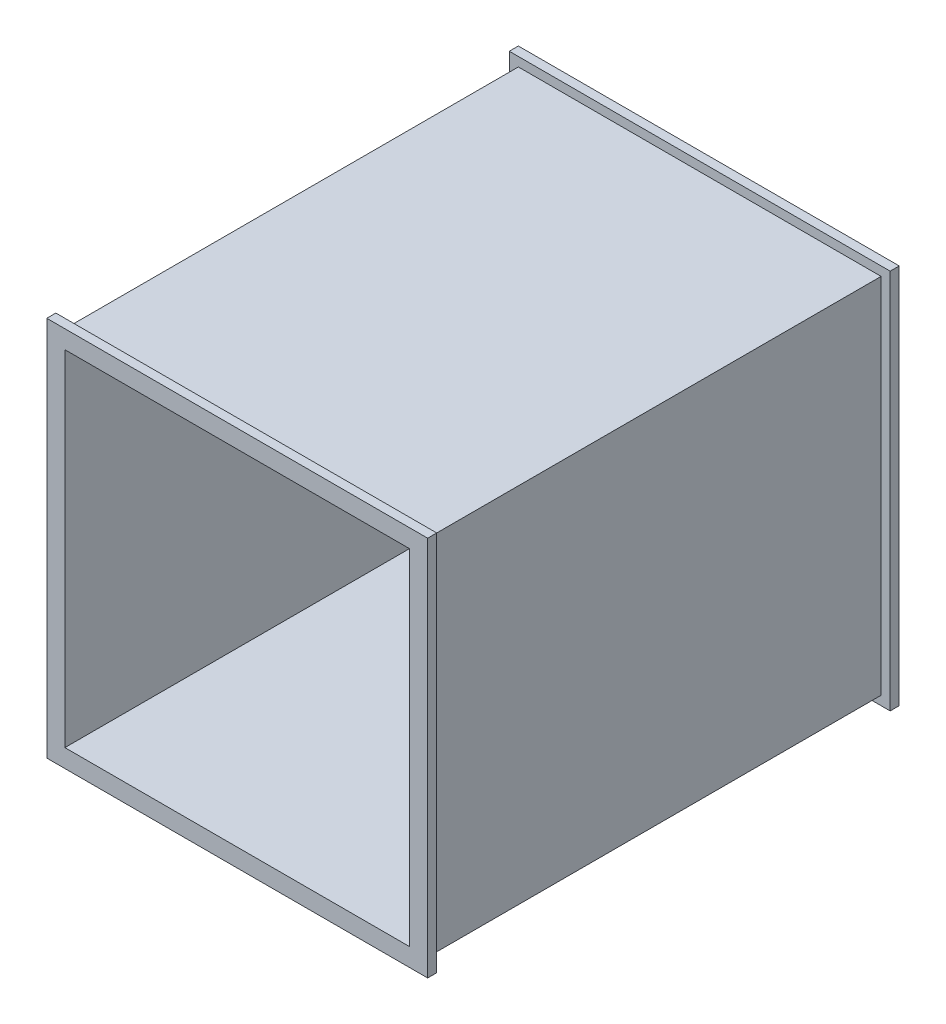
ISO-10303-21;
HEADER;
FILE_DESCRIPTION(('STEP AP214'),'2;1');
FILE_NAME('part.step','',(''),(''),'','','');
FILE_SCHEMA(('AUTOMOTIVE_DESIGN { 1 0 10303 214 1 1 1 1 }'));
ENDSEC;
DATA;
#1=APPLICATION_CONTEXT('core data for automotive mechanical design processes');
#2=APPLICATION_PROTOCOL_DEFINITION('international standard','automotive_design',2000,#1);
#3=PRODUCT_CONTEXT('',#1,'mechanical');
#4=PRODUCT('Part','Part','',(#3));
#5=PRODUCT_RELATED_PRODUCT_CATEGORY('part','',(#4));
#6=PRODUCT_DEFINITION_FORMATION('','',#4);
#7=PRODUCT_DEFINITION_CONTEXT('part definition',#1,'design');
#8=PRODUCT_DEFINITION('design','',#6,#7);
#9=PRODUCT_DEFINITION_SHAPE('','',#8);
#10=(LENGTH_UNIT() NAMED_UNIT(*) SI_UNIT(.MILLI.,.METRE.));
#11=(NAMED_UNIT(*) PLANE_ANGLE_UNIT() SI_UNIT($,.RADIAN.));
#12=(NAMED_UNIT(*) SI_UNIT($,.STERADIAN.) SOLID_ANGLE_UNIT());
#13=UNCERTAINTY_MEASURE_WITH_UNIT(LENGTH_MEASURE(1.E-05),#10,'distance_accuracy_value','');
#14=(GEOMETRIC_REPRESENTATION_CONTEXT(3) GLOBAL_UNCERTAINTY_ASSIGNED_CONTEXT((#13)) GLOBAL_UNIT_ASSIGNED_CONTEXT((#10,
#11,#12)) REPRESENTATION_CONTEXT('',''));
#15=CARTESIAN_POINT('',(0.,0.,0.));
#16=DIRECTION('',(0.,0.,1.));
#17=DIRECTION('',(1.,0.,0.));
#18=AXIS2_PLACEMENT_3D('',#15,#16,#17);
#19=CARTESIAN_POINT('',(100.,100.,250.));
#20=DIRECTION('',(-1.,0.,0.));
#21=DIRECTION('',(0.,-1.,0.));
#22=AXIS2_PLACEMENT_3D('',#19,#20,#21);
#23=PLANE('',#22);
#24=DIRECTION('',(0.,1.,0.));
#25=VECTOR('',#24,1.);
#26=CARTESIAN_POINT('',(100.,100.,0.));
#27=LINE('',#26,#25);
#28=CARTESIAN_POINT('',(100.,-100.,0.));
#29=VERTEX_POINT('',#28);
#30=CARTESIAN_POINT('',(100.,100.,0.));
#31=VERTEX_POINT('',#30);
#32=EDGE_CURVE('E246',#29,#31,#27,.T.);
#33=ORIENTED_EDGE('',*,*,#32,.T.);
#34=DIRECTION('',(0.,0.,-1.));
#35=VECTOR('',#34,1.);
#36=CARTESIAN_POINT('',(100.,100.,250.));
#37=LINE('',#36,#35);
#38=CARTESIAN_POINT('',(100.,100.,250.));
#39=VERTEX_POINT('',#38);
#40=EDGE_CURVE('E11',#39,#31,#37,.T.);
#41=ORIENTED_EDGE('',*,*,#40,.F.);
#42=DIRECTION('',(0.,1.,0.));
#43=VECTOR('',#42,1.);
#44=CARTESIAN_POINT('',(100.,100.,250.));
#45=LINE('',#44,#43);
#46=CARTESIAN_POINT('',(100.,-100.,250.));
#47=VERTEX_POINT('',#46);
#48=EDGE_CURVE('E247',#47,#39,#45,.T.);
#49=ORIENTED_EDGE('',*,*,#48,.F.);
#50=DIRECTION('',(0.,0.,-1.));
#51=VECTOR('',#50,1.);
#52=CARTESIAN_POINT('',(100.,-100.,250.));
#53=LINE('',#52,#51);
#54=EDGE_CURVE('E260',#47,#29,#53,.T.);
#55=ORIENTED_EDGE('',*,*,#54,.T.);
#56=EDGE_LOOP('',(#33,#41,#49,#55));
#57=FACE_BOUND('',#56,.T.);
#58=ADVANCED_FACE('F39',(#57),#23,.F.);
#59=CARTESIAN_POINT('',(-100.,100.,250.));
#60=DIRECTION('',(0.,-1.,0.));
#61=DIRECTION('',(0.,0.,-1.));
#62=AXIS2_PLACEMENT_3D('',#59,#60,#61);
#63=PLANE('',#62);
#64=DIRECTION('',(-1.,0.,0.));
#65=VECTOR('',#64,1.);
#66=CARTESIAN_POINT('',(-100.,100.,0.));
#67=LINE('',#66,#65);
#68=CARTESIAN_POINT('',(-100.,100.,0.));
#69=VERTEX_POINT('',#68);
#70=EDGE_CURVE('E263',#31,#69,#67,.T.);
#71=ORIENTED_EDGE('',*,*,#70,.T.);
#72=DIRECTION('',(0.,0.,-1.));
#73=VECTOR('',#72,1.);
#74=CARTESIAN_POINT('',(-100.,100.,250.));
#75=LINE('',#74,#73);
#76=CARTESIAN_POINT('',(-100.,100.,250.));
#77=VERTEX_POINT('',#76);
#78=EDGE_CURVE('E46',#77,#69,#75,.T.);
#79=ORIENTED_EDGE('',*,*,#78,.F.);
#80=DIRECTION('',(-1.,0.,0.));
#81=VECTOR('',#80,1.);
#82=CARTESIAN_POINT('',(-100.,100.,250.));
#83=LINE('',#82,#81);
#84=EDGE_CURVE('E250',#39,#77,#83,.T.);
#85=ORIENTED_EDGE('',*,*,#84,.F.);
#86=ORIENTED_EDGE('',*,*,#40,.T.);
#87=EDGE_LOOP('',(#71,#79,#85,#86));
#88=FACE_BOUND('',#87,.T.);
#89=ADVANCED_FACE('F280',(#88),#63,.F.);
#90=CARTESIAN_POINT('',(-100.,100.,250.));
#91=DIRECTION('',(1.,0.,0.));
#92=DIRECTION('',(0.,1.,0.));
#93=AXIS2_PLACEMENT_3D('',#90,#91,#92);
#94=PLANE('',#93);
#95=DIRECTION('',(0.,-1.,0.));
#96=VECTOR('',#95,1.);
#97=CARTESIAN_POINT('',(-100.,100.,0.));
#98=LINE('',#97,#96);
#99=CARTESIAN_POINT('',(-100.,-100.,0.));
#100=VERTEX_POINT('',#99);
#101=EDGE_CURVE('E266',#69,#100,#98,.T.);
#102=ORIENTED_EDGE('',*,*,#101,.T.);
#103=DIRECTION('',(0.,0.,-1.));
#104=VECTOR('',#103,1.);
#105=CARTESIAN_POINT('',(-100.,-100.,250.));
#106=LINE('',#105,#104);
#107=CARTESIAN_POINT('',(-100.,-100.,250.));
#108=VERTEX_POINT('',#107);
#109=EDGE_CURVE('E273',#108,#100,#106,.T.);
#110=ORIENTED_EDGE('',*,*,#109,.F.);
#111=DIRECTION('',(0.,-1.,0.));
#112=VECTOR('',#111,1.);
#113=CARTESIAN_POINT('',(-100.,100.,250.));
#114=LINE('',#113,#112);
#115=EDGE_CURVE('E254',#77,#108,#114,.T.);
#116=ORIENTED_EDGE('',*,*,#115,.F.);
#117=ORIENTED_EDGE('',*,*,#78,.T.);
#118=EDGE_LOOP('',(#102,#110,#116,#117));
#119=FACE_BOUND('',#118,.T.);
#120=ADVANCED_FACE('F278',(#119),#94,.F.);
#121=CARTESIAN_POINT('',(-100.,-100.,250.));
#122=DIRECTION('',(0.,1.,0.));
#123=DIRECTION('',(0.,0.,1.));
#124=AXIS2_PLACEMENT_3D('',#121,#122,#123);
#125=PLANE('',#124);
#126=DIRECTION('',(1.,0.,0.));
#127=VECTOR('',#126,1.);
#128=CARTESIAN_POINT('',(-100.,-100.,0.));
#129=LINE('',#128,#127);
#130=EDGE_CURVE('E251',#100,#29,#129,.T.);
#131=ORIENTED_EDGE('',*,*,#130,.T.);
#132=ORIENTED_EDGE('',*,*,#54,.F.);
#133=DIRECTION('',(1.,0.,0.));
#134=VECTOR('',#133,1.);
#135=CARTESIAN_POINT('',(-100.,-100.,250.));
#136=LINE('',#135,#134);
#137=EDGE_CURVE('E257',#108,#47,#136,.T.);
#138=ORIENTED_EDGE('',*,*,#137,.F.);
#139=ORIENTED_EDGE('',*,*,#109,.T.);
#140=EDGE_LOOP('',(#131,#132,#138,#139));
#141=FACE_BOUND('',#140,.T.);
#142=ADVANCED_FACE('F287',(#141),#125,.F.);
#143=CARTESIAN_POINT('',(0.,0.,250.));
#144=DIRECTION('',(0.,0.,1.));
#145=DIRECTION('',(1.,0.,0.));
#146=AXIS2_PLACEMENT_3D('',#143,#144,#145);
#147=PLANE('',#146);
#148=DIRECTION('',(1.,0.,0.));
#149=VECTOR('',#148,1.);
#150=CARTESIAN_POINT('',(-105.,-105.,250.));
#151=LINE('',#150,#149);
#152=CARTESIAN_POINT('',(-105.,-105.,250.));
#153=VERTEX_POINT('',#152);
#154=CARTESIAN_POINT('',(105.,-105.,250.));
#155=VERTEX_POINT('',#154);
#156=EDGE_CURVE('E216',#153,#155,#151,.T.);
#157=ORIENTED_EDGE('',*,*,#156,.F.);
#158=DIRECTION('',(0.,-1.,0.));
#159=VECTOR('',#158,1.);
#160=CARTESIAN_POINT('',(-105.,105.,250.));
#161=LINE('',#160,#159);
#162=CARTESIAN_POINT('',(-105.,105.,250.));
#163=VERTEX_POINT('',#162);
#164=EDGE_CURVE('E221',#163,#153,#161,.T.);
#165=ORIENTED_EDGE('',*,*,#164,.F.);
#166=DIRECTION('',(-1.,0.,0.));
#167=VECTOR('',#166,1.);
#168=CARTESIAN_POINT('',(105.,105.,250.));
#169=LINE('',#168,#167);
#170=CARTESIAN_POINT('',(105.,105.,250.));
#171=VERTEX_POINT('',#170);
#172=EDGE_CURVE('E232',#171,#163,#169,.T.);
#173=ORIENTED_EDGE('',*,*,#172,.F.);
#174=DIRECTION('',(0.,1.,0.));
#175=VECTOR('',#174,1.);
#176=CARTESIAN_POINT('',(105.,-105.,250.));
#177=LINE('',#176,#175);
#178=EDGE_CURVE('E230',#155,#171,#177,.T.);
#179=ORIENTED_EDGE('',*,*,#178,.F.);
#180=EDGE_LOOP('',(#157,#165,#173,#179));
#181=FACE_BOUND('',#180,.T.);
#182=ORIENTED_EDGE('',*,*,#137,.T.);
#183=ORIENTED_EDGE('',*,*,#48,.T.);
#184=ORIENTED_EDGE('',*,*,#84,.T.);
#185=ORIENTED_EDGE('',*,*,#115,.T.);
#186=EDGE_LOOP('',(#182,#183,#184,#185));
#187=FACE_BOUND('',#186,.T.);
#188=ADVANCED_FACE('F291',(#181,#187),#147,.F.);
#189=CARTESIAN_POINT('',(-105.,-105.,255.));
#190=DIRECTION('',(0.,1.,0.));
#191=DIRECTION('',(0.,0.,1.));
#192=AXIS2_PLACEMENT_3D('',#189,#190,#191);
#193=PLANE('',#192);
#194=ORIENTED_EDGE('',*,*,#156,.T.);
#195=DIRECTION('',(0.,0.,-1.));
#196=VECTOR('',#195,1.);
#197=CARTESIAN_POINT('',(105.,-105.,255.));
#198=LINE('',#197,#196);
#199=CARTESIAN_POINT('',(105.,-105.,255.));
#200=VERTEX_POINT('',#199);
#201=EDGE_CURVE('E243',#200,#155,#198,.T.);
#202=ORIENTED_EDGE('',*,*,#201,.F.);
#203=DIRECTION('',(1.,0.,0.));
#204=VECTOR('',#203,1.);
#205=CARTESIAN_POINT('',(-105.,-105.,255.));
#206=LINE('',#205,#204);
#207=CARTESIAN_POINT('',(-105.,-105.,255.));
#208=VERTEX_POINT('',#207);
#209=EDGE_CURVE('E217',#208,#200,#206,.T.);
#210=ORIENTED_EDGE('',*,*,#209,.F.);
#211=DIRECTION('',(0.,0.,-1.));
#212=VECTOR('',#211,1.);
#213=CARTESIAN_POINT('',(-105.,-105.,255.));
#214=LINE('',#213,#212);
#215=EDGE_CURVE('E227',#208,#153,#214,.T.);
#216=ORIENTED_EDGE('',*,*,#215,.T.);
#217=EDGE_LOOP('',(#194,#202,#210,#216));
#218=FACE_BOUND('',#217,.T.);
#219=ADVANCED_FACE('F293',(#218),#193,.F.);
#220=CARTESIAN_POINT('',(105.,-105.,255.));
#221=DIRECTION('',(-1.,0.,0.));
#222=DIRECTION('',(0.,-1.,0.));
#223=AXIS2_PLACEMENT_3D('',#220,#221,#222);
#224=PLANE('',#223);
#225=ORIENTED_EDGE('',*,*,#178,.T.);
#226=DIRECTION('',(0.,0.,-1.));
#227=VECTOR('',#226,1.);
#228=CARTESIAN_POINT('',(105.,105.,255.));
#229=LINE('',#228,#227);
#230=CARTESIAN_POINT('',(105.,105.,255.));
#231=VERTEX_POINT('',#230);
#232=EDGE_CURVE('E240',#231,#171,#229,.T.);
#233=ORIENTED_EDGE('',*,*,#232,.F.);
#234=DIRECTION('',(0.,1.,0.));
#235=VECTOR('',#234,1.);
#236=CARTESIAN_POINT('',(105.,-105.,255.));
#237=LINE('',#236,#235);
#238=EDGE_CURVE('E220',#200,#231,#237,.T.);
#239=ORIENTED_EDGE('',*,*,#238,.F.);
#240=ORIENTED_EDGE('',*,*,#201,.T.);
#241=EDGE_LOOP('',(#225,#233,#239,#240));
#242=FACE_BOUND('',#241,.T.);
#243=ADVANCED_FACE('F299',(#242),#224,.F.);
#244=CARTESIAN_POINT('',(105.,105.,255.));
#245=DIRECTION('',(0.,-1.,0.));
#246=DIRECTION('',(0.,0.,-1.));
#247=AXIS2_PLACEMENT_3D('',#244,#245,#246);
#248=PLANE('',#247);
#249=ORIENTED_EDGE('',*,*,#172,.T.);
#250=DIRECTION('',(0.,0.,-1.));
#251=VECTOR('',#250,1.);
#252=CARTESIAN_POINT('',(-105.,105.,255.));
#253=LINE('',#252,#251);
#254=CARTESIAN_POINT('',(-105.,105.,255.));
#255=VERTEX_POINT('',#254);
#256=EDGE_CURVE('E237',#255,#163,#253,.T.);
#257=ORIENTED_EDGE('',*,*,#256,.F.);
#258=DIRECTION('',(-1.,0.,0.));
#259=VECTOR('',#258,1.);
#260=CARTESIAN_POINT('',(105.,105.,255.));
#261=LINE('',#260,#259);
#262=EDGE_CURVE('E223',#231,#255,#261,.T.);
#263=ORIENTED_EDGE('',*,*,#262,.F.);
#264=ORIENTED_EDGE('',*,*,#232,.T.);
#265=EDGE_LOOP('',(#249,#257,#263,#264));
#266=FACE_BOUND('',#265,.T.);
#267=ADVANCED_FACE('F319',(#266),#248,.F.);
#268=CARTESIAN_POINT('',(-105.,105.,255.));
#269=DIRECTION('',(1.,0.,0.));
#270=DIRECTION('',(0.,1.,0.));
#271=AXIS2_PLACEMENT_3D('',#268,#269,#270);
#272=PLANE('',#271);
#273=ORIENTED_EDGE('',*,*,#164,.T.);
#274=ORIENTED_EDGE('',*,*,#215,.F.);
#275=DIRECTION('',(0.,-1.,0.));
#276=VECTOR('',#275,1.);
#277=CARTESIAN_POINT('',(-105.,105.,255.));
#278=LINE('',#277,#276);
#279=EDGE_CURVE('E225',#255,#208,#278,.T.);
#280=ORIENTED_EDGE('',*,*,#279,.F.);
#281=ORIENTED_EDGE('',*,*,#256,.T.);
#282=EDGE_LOOP('',(#273,#274,#280,#281));
#283=FACE_BOUND('',#282,.T.);
#284=ADVANCED_FACE('F322',(#283),#272,.F.);
#285=CARTESIAN_POINT('',(0.,0.,255.));
#286=DIRECTION('',(0.,0.,1.));
#287=DIRECTION('',(1.,0.,0.));
#288=AXIS2_PLACEMENT_3D('',#285,#286,#287);
#289=PLANE('',#288);
#290=DIRECTION('',(1.,0.,0.));
#291=VECTOR('',#290,1.);
#292=CARTESIAN_POINT('',(-95.,-95.,255.));
#293=LINE('',#292,#291);
#294=CARTESIAN_POINT('',(-95.,-95.,255.));
#295=VERTEX_POINT('',#294);
#296=CARTESIAN_POINT('',(95.,-95.,255.));
#297=VERTEX_POINT('',#296);
#298=EDGE_CURVE('E53',#295,#297,#293,.T.);
#299=ORIENTED_EDGE('',*,*,#298,.F.);
#300=DIRECTION('',(0.,-1.,0.));
#301=VECTOR('',#300,1.);
#302=CARTESIAN_POINT('',(-95.,95.,255.));
#303=LINE('',#302,#301);
#304=CARTESIAN_POINT('',(-95.,95.,255.));
#305=VERTEX_POINT('',#304);
#306=EDGE_CURVE('E168',#305,#295,#303,.T.);
#307=ORIENTED_EDGE('',*,*,#306,.F.);
#308=DIRECTION('',(1.,0.,0.));
#309=VECTOR('',#308,1.);
#310=CARTESIAN_POINT('',(-95.,95.,255.));
#311=LINE('',#310,#309);
#312=CARTESIAN_POINT('',(95.,95.,255.));
#313=VERTEX_POINT('',#312);
#314=EDGE_CURVE('E171',#305,#313,#311,.T.);
#315=ORIENTED_EDGE('',*,*,#314,.T.);
#316=DIRECTION('',(0.,-1.,0.));
#317=VECTOR('',#316,1.);
#318=CARTESIAN_POINT('',(95.,95.,255.));
#319=LINE('',#318,#317);
#320=EDGE_CURVE('E177',#313,#297,#319,.T.);
#321=ORIENTED_EDGE('',*,*,#320,.T.);
#322=EDGE_LOOP('',(#299,#307,#315,#321));
#323=FACE_BOUND('',#322,.T.);
#324=ORIENTED_EDGE('',*,*,#209,.T.);
#325=ORIENTED_EDGE('',*,*,#238,.T.);
#326=ORIENTED_EDGE('',*,*,#262,.T.);
#327=ORIENTED_EDGE('',*,*,#279,.T.);
#328=EDGE_LOOP('',(#324,#325,#326,#327));
#329=FACE_BOUND('',#328,.T.);
#330=ADVANCED_FACE('F324',(#323,#329),#289,.T.);
#331=CARTESIAN_POINT('',(-105.,105.,-5.));
#332=DIRECTION('',(0.,-1.,0.));
#333=DIRECTION('',(0.,0.,-1.));
#334=AXIS2_PLACEMENT_3D('',#331,#332,#333);
#335=PLANE('',#334);
#336=DIRECTION('',(1.,0.,0.));
#337=VECTOR('',#336,1.);
#338=CARTESIAN_POINT('',(-105.,105.,0.));
#339=LINE('',#338,#337);
#340=CARTESIAN_POINT('',(-105.,105.,0.));
#341=VERTEX_POINT('',#340);
#342=CARTESIAN_POINT('',(105.,105.,0.));
#343=VERTEX_POINT('',#342);
#344=EDGE_CURVE('E183',#341,#343,#339,.T.);
#345=ORIENTED_EDGE('',*,*,#344,.T.);
#346=DIRECTION('',(0.,0.,1.));
#347=VECTOR('',#346,1.);
#348=CARTESIAN_POINT('',(105.,105.,-5.));
#349=LINE('',#348,#347);
#350=CARTESIAN_POINT('',(105.,105.,-5.));
#351=VERTEX_POINT('',#350);
#352=EDGE_CURVE('E213',#351,#343,#349,.T.);
#353=ORIENTED_EDGE('',*,*,#352,.F.);
#354=DIRECTION('',(1.,0.,0.));
#355=VECTOR('',#354,1.);
#356=CARTESIAN_POINT('',(-105.,105.,-5.));
#357=LINE('',#356,#355);
#358=CARTESIAN_POINT('',(-105.,105.,-5.));
#359=VERTEX_POINT('',#358);
#360=EDGE_CURVE('E187',#359,#351,#357,.T.);
#361=ORIENTED_EDGE('',*,*,#360,.F.);
#362=DIRECTION('',(0.,0.,1.));
#363=VECTOR('',#362,1.);
#364=CARTESIAN_POINT('',(-105.,105.,-5.));
#365=LINE('',#364,#363);
#366=EDGE_CURVE('E197',#359,#341,#365,.T.);
#367=ORIENTED_EDGE('',*,*,#366,.T.);
#368=EDGE_LOOP('',(#345,#353,#361,#367));
#369=FACE_BOUND('',#368,.T.);
#370=ADVANCED_FACE('F329',(#369),#335,.F.);
#371=CARTESIAN_POINT('',(105.,105.,-5.));
#372=DIRECTION('',(-1.,0.,0.));
#373=DIRECTION('',(0.,-1.,0.));
#374=AXIS2_PLACEMENT_3D('',#371,#372,#373);
#375=PLANE('',#374);
#376=DIRECTION('',(0.,-1.,0.));
#377=VECTOR('',#376,1.);
#378=CARTESIAN_POINT('',(105.,105.,0.));
#379=LINE('',#378,#377);
#380=CARTESIAN_POINT('',(105.,-105.,0.));
#381=VERTEX_POINT('',#380);
#382=EDGE_CURVE('E200',#343,#381,#379,.T.);
#383=ORIENTED_EDGE('',*,*,#382,.T.);
#384=DIRECTION('',(0.,0.,1.));
#385=VECTOR('',#384,1.);
#386=CARTESIAN_POINT('',(105.,-105.,-5.));
#387=LINE('',#386,#385);
#388=CARTESIAN_POINT('',(105.,-105.,-5.));
#389=VERTEX_POINT('',#388);
#390=EDGE_CURVE('E210',#389,#381,#387,.T.);
#391=ORIENTED_EDGE('',*,*,#390,.F.);
#392=DIRECTION('',(0.,-1.,0.));
#393=VECTOR('',#392,1.);
#394=CARTESIAN_POINT('',(105.,105.,-5.));
#395=LINE('',#394,#393);
#396=EDGE_CURVE('E190',#351,#389,#395,.T.);
#397=ORIENTED_EDGE('',*,*,#396,.F.);
#398=ORIENTED_EDGE('',*,*,#352,.T.);
#399=EDGE_LOOP('',(#383,#391,#397,#398));
#400=FACE_BOUND('',#399,.T.);
#401=ADVANCED_FACE('F346',(#400),#375,.F.);
#402=CARTESIAN_POINT('',(105.,-105.,-5.));
#403=DIRECTION('',(0.,1.,0.));
#404=DIRECTION('',(0.,0.,1.));
#405=AXIS2_PLACEMENT_3D('',#402,#403,#404);
#406=PLANE('',#405);
#407=DIRECTION('',(-1.,0.,0.));
#408=VECTOR('',#407,1.);
#409=CARTESIAN_POINT('',(105.,-105.,0.));
#410=LINE('',#409,#408);
#411=CARTESIAN_POINT('',(-105.,-105.,0.));
#412=VERTEX_POINT('',#411);
#413=EDGE_CURVE('E202',#381,#412,#410,.T.);
#414=ORIENTED_EDGE('',*,*,#413,.T.);
#415=DIRECTION('',(0.,0.,1.));
#416=VECTOR('',#415,1.);
#417=CARTESIAN_POINT('',(-105.,-105.,-5.));
#418=LINE('',#417,#416);
#419=CARTESIAN_POINT('',(-105.,-105.,-5.));
#420=VERTEX_POINT('',#419);
#421=EDGE_CURVE('E207',#420,#412,#418,.T.);
#422=ORIENTED_EDGE('',*,*,#421,.F.);
#423=DIRECTION('',(-1.,0.,0.));
#424=VECTOR('',#423,1.);
#425=CARTESIAN_POINT('',(105.,-105.,-5.));
#426=LINE('',#425,#424);
#427=EDGE_CURVE('E193',#389,#420,#426,.T.);
#428=ORIENTED_EDGE('',*,*,#427,.F.);
#429=ORIENTED_EDGE('',*,*,#390,.T.);
#430=EDGE_LOOP('',(#414,#422,#428,#429));
#431=FACE_BOUND('',#430,.T.);
#432=ADVANCED_FACE('F352',(#431),#406,.F.);
#433=CARTESIAN_POINT('',(-105.,-105.,-5.));
#434=DIRECTION('',(1.,0.,0.));
#435=DIRECTION('',(0.,1.,0.));
#436=AXIS2_PLACEMENT_3D('',#433,#434,#435);
#437=PLANE('',#436);
#438=DIRECTION('',(0.,1.,0.));
#439=VECTOR('',#438,1.);
#440=CARTESIAN_POINT('',(-105.,-105.,0.));
#441=LINE('',#440,#439);
#442=EDGE_CURVE('E191',#412,#341,#441,.T.);
#443=ORIENTED_EDGE('',*,*,#442,.T.);
#444=ORIENTED_EDGE('',*,*,#366,.F.);
#445=DIRECTION('',(0.,1.,0.));
#446=VECTOR('',#445,1.);
#447=CARTESIAN_POINT('',(-105.,-105.,-5.));
#448=LINE('',#447,#446);
#449=EDGE_CURVE('E195',#420,#359,#448,.T.);
#450=ORIENTED_EDGE('',*,*,#449,.F.);
#451=ORIENTED_EDGE('',*,*,#421,.T.);
#452=EDGE_LOOP('',(#443,#444,#450,#451));
#453=FACE_BOUND('',#452,.T.);
#454=ADVANCED_FACE('F356',(#453),#437,.F.);
#455=CARTESIAN_POINT('',(0.,0.,-5.));
#456=DIRECTION('',(0.,0.,-1.));
#457=DIRECTION('',(-1.,0.,0.));
#458=AXIS2_PLACEMENT_3D('',#455,#456,#457);
#459=PLANE('',#458);
#460=DIRECTION('',(1.,0.,0.));
#461=VECTOR('',#460,1.);
#462=CARTESIAN_POINT('',(-95.,-95.,-5.));
#463=LINE('',#462,#461);
#464=CARTESIAN_POINT('',(-95.,-95.,-5.));
#465=VERTEX_POINT('',#464);
#466=CARTESIAN_POINT('',(95.,-95.,-5.));
#467=VERTEX_POINT('',#466);
#468=EDGE_CURVE('E158',#465,#467,#463,.T.);
#469=ORIENTED_EDGE('',*,*,#468,.T.);
#470=DIRECTION('',(0.,-1.,0.));
#471=VECTOR('',#470,1.);
#472=CARTESIAN_POINT('',(95.,95.,-5.));
#473=LINE('',#472,#471);
#474=CARTESIAN_POINT('',(95.,95.,-5.));
#475=VERTEX_POINT('',#474);
#476=EDGE_CURVE('E150',#475,#467,#473,.T.);
#477=ORIENTED_EDGE('',*,*,#476,.F.);
#478=DIRECTION('',(1.,0.,0.));
#479=VECTOR('',#478,1.);
#480=CARTESIAN_POINT('',(-95.,95.,-5.));
#481=LINE('',#480,#479);
#482=CARTESIAN_POINT('',(-95.,95.,-5.));
#483=VERTEX_POINT('',#482);
#484=EDGE_CURVE('E157',#483,#475,#481,.T.);
#485=ORIENTED_EDGE('',*,*,#484,.F.);
#486=DIRECTION('',(0.,-1.,0.));
#487=VECTOR('',#486,1.);
#488=CARTESIAN_POINT('',(-95.,95.,-5.));
#489=LINE('',#488,#487);
#490=EDGE_CURVE('E163',#483,#465,#489,.T.);
#491=ORIENTED_EDGE('',*,*,#490,.T.);
#492=EDGE_LOOP('',(#469,#477,#485,#491));
#493=FACE_BOUND('',#492,.T.);
#494=ORIENTED_EDGE('',*,*,#360,.T.);
#495=ORIENTED_EDGE('',*,*,#396,.T.);
#496=ORIENTED_EDGE('',*,*,#427,.T.);
#497=ORIENTED_EDGE('',*,*,#449,.T.);
#498=EDGE_LOOP('',(#494,#495,#496,#497));
#499=FACE_BOUND('',#498,.T.);
#500=ADVANCED_FACE('F165',(#493,#499),#459,.T.);
#501=CARTESIAN_POINT('',(0.,0.,0.));
#502=DIRECTION('',(0.,0.,-1.));
#503=DIRECTION('',(-1.,0.,0.));
#504=AXIS2_PLACEMENT_3D('',#501,#502,#503);
#505=PLANE('',#504);
#506=ORIENTED_EDGE('',*,*,#32,.F.);
#507=ORIENTED_EDGE('',*,*,#130,.F.);
#508=ORIENTED_EDGE('',*,*,#101,.F.);
#509=ORIENTED_EDGE('',*,*,#70,.F.);
#510=EDGE_LOOP('',(#506,#507,#508,#509));
#511=FACE_BOUND('',#510,.T.);
#512=ORIENTED_EDGE('',*,*,#344,.F.);
#513=ORIENTED_EDGE('',*,*,#442,.F.);
#514=ORIENTED_EDGE('',*,*,#413,.F.);
#515=ORIENTED_EDGE('',*,*,#382,.F.);
#516=EDGE_LOOP('',(#512,#513,#514,#515));
#517=FACE_BOUND('',#516,.T.);
#518=ADVANCED_FACE('F283',(#511,#517),#505,.F.);
#519=CARTESIAN_POINT('',(-95.,-95.,-5.));
#520=DIRECTION('',(0.,-1.,0.));
#521=DIRECTION('',(0.,0.,-1.));
#522=AXIS2_PLACEMENT_3D('',#519,#520,#521);
#523=PLANE('',#522);
#524=ORIENTED_EDGE('',*,*,#298,.T.);
#525=DIRECTION('',(0.,0.,1.));
#526=VECTOR('',#525,1.);
#527=CARTESIAN_POINT('',(95.,-95.,-5.));
#528=LINE('',#527,#526);
#529=EDGE_CURVE('E152',#467,#297,#528,.T.);
#530=ORIENTED_EDGE('',*,*,#529,.F.);
#531=ORIENTED_EDGE('',*,*,#468,.F.);
#532=DIRECTION('',(0.,0.,1.));
#533=VECTOR('',#532,1.);
#534=CARTESIAN_POINT('',(-95.,-95.,-5.));
#535=LINE('',#534,#533);
#536=EDGE_CURVE('E181',#465,#295,#535,.T.);
#537=ORIENTED_EDGE('',*,*,#536,.T.);
#538=EDGE_LOOP('',(#524,#530,#531,#537));
#539=FACE_BOUND('',#538,.T.);
#540=ADVANCED_FACE('F161',(#539),#523,.F.);
#541=CARTESIAN_POINT('',(-95.,95.,-5.));
#542=DIRECTION('',(-1.,0.,0.));
#543=DIRECTION('',(0.,-1.,0.));
#544=AXIS2_PLACEMENT_3D('',#541,#542,#543);
#545=PLANE('',#544);
#546=ORIENTED_EDGE('',*,*,#306,.T.);
#547=ORIENTED_EDGE('',*,*,#536,.F.);
#548=ORIENTED_EDGE('',*,*,#490,.F.);
#549=DIRECTION('',(0.,0.,1.));
#550=VECTOR('',#549,1.);
#551=CARTESIAN_POINT('',(-95.,95.,-5.));
#552=LINE('',#551,#550);
#553=EDGE_CURVE('E184',#483,#305,#552,.T.);
#554=ORIENTED_EDGE('',*,*,#553,.T.);
#555=EDGE_LOOP('',(#546,#547,#548,#554));
#556=FACE_BOUND('',#555,.T.);
#557=ADVANCED_FACE('F365',(#556),#545,.F.);
#558=CARTESIAN_POINT('',(-95.,95.,-5.));
#559=DIRECTION('',(0.,-1.,0.));
#560=DIRECTION('',(0.,0.,-1.));
#561=AXIS2_PLACEMENT_3D('',#558,#559,#560);
#562=PLANE('',#561);
#563=ORIENTED_EDGE('',*,*,#314,.F.);
#564=ORIENTED_EDGE('',*,*,#553,.F.);
#565=ORIENTED_EDGE('',*,*,#484,.T.);
#566=DIRECTION('',(0.,0.,1.));
#567=VECTOR('',#566,1.);
#568=CARTESIAN_POINT('',(95.,95.,-5.));
#569=LINE('',#568,#567);
#570=EDGE_CURVE('E61',#475,#313,#569,.T.);
#571=ORIENTED_EDGE('',*,*,#570,.T.);
#572=EDGE_LOOP('',(#563,#564,#565,#571));
#573=FACE_BOUND('',#572,.T.);
#574=ADVANCED_FACE('F368',(#573),#562,.T.);
#575=CARTESIAN_POINT('',(95.,95.,-5.));
#576=DIRECTION('',(-1.,0.,0.));
#577=DIRECTION('',(0.,-1.,0.));
#578=AXIS2_PLACEMENT_3D('',#575,#576,#577);
#579=PLANE('',#578);
#580=ORIENTED_EDGE('',*,*,#320,.F.);
#581=ORIENTED_EDGE('',*,*,#570,.F.);
#582=ORIENTED_EDGE('',*,*,#476,.T.);
#583=ORIENTED_EDGE('',*,*,#529,.T.);
#584=EDGE_LOOP('',(#580,#581,#582,#583));
#585=FACE_BOUND('',#584,.T.);
#586=ADVANCED_FACE('F151',(#585),#579,.T.);
#587=CLOSED_SHELL('',(#58,#89,#120,#142,#188,#219,#243,#267,#284,#330,#370,#401,#432,#454,#500,
#518,#540,#557,#574,#586));
#588=MANIFOLD_SOLID_BREP('B2',#587);
#589=ADVANCED_BREP_SHAPE_REPRESENTATION('',(#18,#588),#14);
#590=SHAPE_DEFINITION_REPRESENTATION(#9,#589);
ENDSEC;
END-ISO-10303-21;
